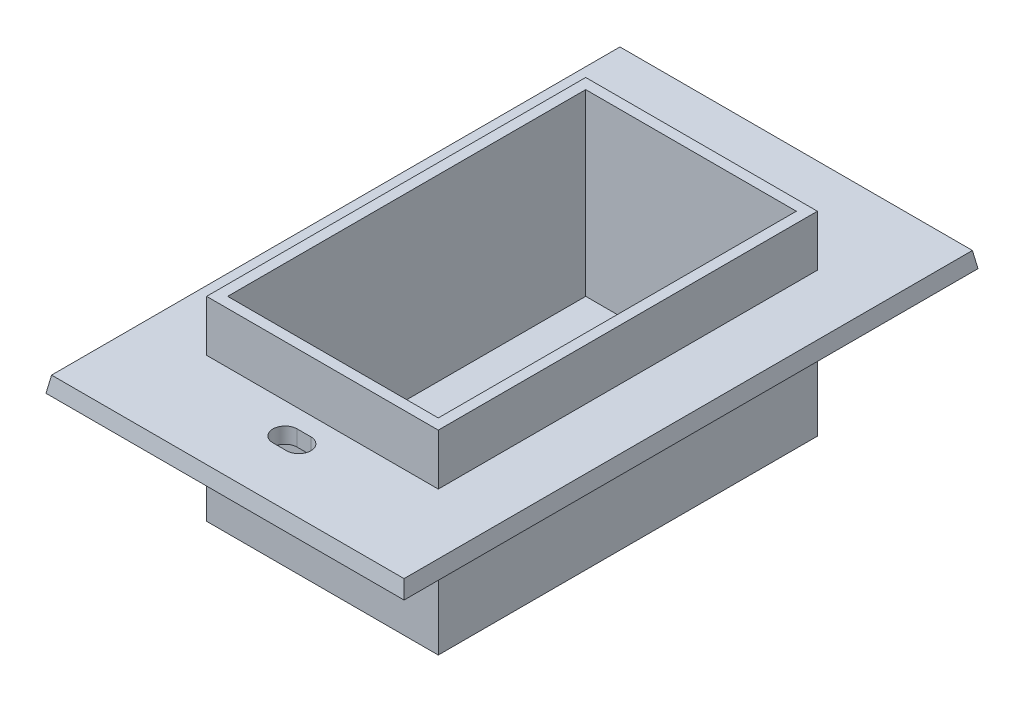
ISO-10303-21;
HEADER;
FILE_DESCRIPTION(('STEP AP214'),'2;1');
FILE_NAME('part.step','',(''),(''),'','','');
FILE_SCHEMA(('AUTOMOTIVE_DESIGN { 1 0 10303 214 1 1 1 1 }'));
ENDSEC;
DATA;
#1=APPLICATION_CONTEXT('core data for automotive mechanical design processes');
#2=APPLICATION_PROTOCOL_DEFINITION('international standard','automotive_design',2000,#1);
#3=PRODUCT_CONTEXT('',#1,'mechanical');
#4=PRODUCT('Part','Part','',(#3));
#5=PRODUCT_RELATED_PRODUCT_CATEGORY('part','',(#4));
#6=PRODUCT_DEFINITION_FORMATION('','',#4);
#7=PRODUCT_DEFINITION_CONTEXT('part definition',#1,'design');
#8=PRODUCT_DEFINITION('design','',#6,#7);
#9=PRODUCT_DEFINITION_SHAPE('','',#8);
#10=(LENGTH_UNIT() NAMED_UNIT(*) SI_UNIT(.MILLI.,.METRE.));
#11=(NAMED_UNIT(*) PLANE_ANGLE_UNIT() SI_UNIT($,.RADIAN.));
#12=(NAMED_UNIT(*) SI_UNIT($,.STERADIAN.) SOLID_ANGLE_UNIT());
#13=UNCERTAINTY_MEASURE_WITH_UNIT(LENGTH_MEASURE(1.E-05),#10,'distance_accuracy_value','');
#14=(GEOMETRIC_REPRESENTATION_CONTEXT(3) GLOBAL_UNCERTAINTY_ASSIGNED_CONTEXT((#13)) GLOBAL_UNIT_ASSIGNED_CONTEXT((#10,
#11,#12)) REPRESENTATION_CONTEXT('',''));
#15=CARTESIAN_POINT('',(0.,0.,0.));
#16=DIRECTION('',(0.,0.,1.));
#17=DIRECTION('',(1.,0.,0.));
#18=AXIS2_PLACEMENT_3D('',#15,#16,#17);
#19=CARTESIAN_POINT('',(0.,3.,0.));
#20=DIRECTION('',(1.,0.,0.));
#21=DIRECTION('',(0.,0.,-1.));
#22=AXIS2_PLACEMENT_3D('',#19,#20,#21);
#23=PLANE('',#22);
#24=DIRECTION('',(0.,-1.,0.));
#25=VECTOR('',#24,1.);
#26=CARTESIAN_POINT('',(0.,3.,-72.));
#27=LINE('',#26,#25);
#28=CARTESIAN_POINT('',(0.,37.,-72.));
#29=VERTEX_POINT('',#28);
#30=CARTESIAN_POINT('',(0.,27.3,-72.));
#31=VERTEX_POINT('',#30);
#32=EDGE_CURVE('E401',#29,#31,#27,.T.);
#33=ORIENTED_EDGE('',*,*,#32,.T.);
#34=DIRECTION('',(0.,0.,1.));
#35=VECTOR('',#34,1.);
#36=CARTESIAN_POINT('',(0.,27.3,-72.));
#37=LINE('',#36,#35);
#38=CARTESIAN_POINT('',(0.,27.3,0.));
#39=VERTEX_POINT('',#38);
#40=EDGE_CURVE('E301',#31,#39,#37,.T.);
#41=ORIENTED_EDGE('',*,*,#40,.T.);
#42=DIRECTION('',(0.,-1.,0.));
#43=VECTOR('',#42,1.);
#44=CARTESIAN_POINT('',(0.,3.,0.));
#45=LINE('',#44,#43);
#46=CARTESIAN_POINT('',(0.,37.,0.));
#47=VERTEX_POINT('',#46);
#48=EDGE_CURVE('E415',#47,#39,#45,.T.);
#49=ORIENTED_EDGE('',*,*,#48,.F.);
#50=DIRECTION('',(0.,0.,1.));
#51=VECTOR('',#50,1.);
#52=CARTESIAN_POINT('',(0.,37.,0.));
#53=LINE('',#52,#51);
#54=EDGE_CURVE('E370',#29,#47,#53,.T.);
#55=ORIENTED_EDGE('',*,*,#54,.F.);
#56=EDGE_LOOP('',(#33,#41,#49,#55));
#57=FACE_BOUND('',#56,.T.);
#58=ADVANCED_FACE('F42',(#57),#23,.F.);
#59=CARTESIAN_POINT('',(0.,3.,0.));
#60=DIRECTION('',(0.,0.,-1.));
#61=DIRECTION('',(-1.,0.,0.));
#62=AXIS2_PLACEMENT_3D('',#59,#60,#61);
#63=PLANE('',#62);
#64=ORIENTED_EDGE('',*,*,#48,.T.);
#65=DIRECTION('',(1.,0.,0.));
#66=VECTOR('',#65,1.);
#67=CARTESIAN_POINT('',(0.,27.3,0.));
#68=LINE('',#67,#66);
#69=CARTESIAN_POINT('',(44.,27.3,0.));
#70=VERTEX_POINT('',#69);
#71=EDGE_CURVE('E289',#39,#70,#68,.T.);
#72=ORIENTED_EDGE('',*,*,#71,.T.);
#73=DIRECTION('',(0.,-1.,0.));
#74=VECTOR('',#73,1.);
#75=CARTESIAN_POINT('',(44.,3.,0.));
#76=LINE('',#75,#74);
#77=CARTESIAN_POINT('',(44.,37.,0.));
#78=VERTEX_POINT('',#77);
#79=EDGE_CURVE('E411',#78,#70,#76,.T.);
#80=ORIENTED_EDGE('',*,*,#79,.F.);
#81=DIRECTION('',(1.,0.,0.));
#82=VECTOR('',#81,1.);
#83=CARTESIAN_POINT('',(0.,37.,0.));
#84=LINE('',#83,#82);
#85=EDGE_CURVE('E374',#47,#78,#84,.T.);
#86=ORIENTED_EDGE('',*,*,#85,.F.);
#87=EDGE_LOOP('',(#64,#72,#80,#86));
#88=FACE_BOUND('',#87,.T.);
#89=ADVANCED_FACE('F476',(#88),#63,.F.);
#90=CARTESIAN_POINT('',(44.,3.,0.));
#91=DIRECTION('',(-1.,0.,0.));
#92=DIRECTION('',(0.,0.,1.));
#93=AXIS2_PLACEMENT_3D('',#90,#91,#92);
#94=PLANE('',#93);
#95=ORIENTED_EDGE('',*,*,#79,.T.);
#96=DIRECTION('',(0.,0.,-1.));
#97=VECTOR('',#96,1.);
#98=CARTESIAN_POINT('',(44.,27.3,-72.));
#99=LINE('',#98,#97);
#100=CARTESIAN_POINT('',(44.,27.3,-72.));
#101=VERTEX_POINT('',#100);
#102=EDGE_CURVE('E292',#70,#101,#99,.T.);
#103=ORIENTED_EDGE('',*,*,#102,.T.);
#104=DIRECTION('',(0.,-1.,0.));
#105=VECTOR('',#104,1.);
#106=CARTESIAN_POINT('',(44.,3.,-72.));
#107=LINE('',#106,#105);
#108=CARTESIAN_POINT('',(44.,37.,-72.));
#109=VERTEX_POINT('',#108);
#110=EDGE_CURVE('E406',#109,#101,#107,.T.);
#111=ORIENTED_EDGE('',*,*,#110,.F.);
#112=DIRECTION('',(0.,0.,-1.));
#113=VECTOR('',#112,1.);
#114=CARTESIAN_POINT('',(44.,37.,0.));
#115=LINE('',#114,#113);
#116=EDGE_CURVE('E377',#78,#109,#115,.T.);
#117=ORIENTED_EDGE('',*,*,#116,.F.);
#118=EDGE_LOOP('',(#95,#103,#111,#117));
#119=FACE_BOUND('',#118,.T.);
#120=ADVANCED_FACE('F483',(#119),#94,.F.);
#121=CARTESIAN_POINT('',(0.,3.,-72.));
#122=DIRECTION('',(0.,0.,1.));
#123=DIRECTION('',(1.,0.,0.));
#124=AXIS2_PLACEMENT_3D('',#121,#122,#123);
#125=PLANE('',#124);
#126=ORIENTED_EDGE('',*,*,#110,.T.);
#127=DIRECTION('',(-1.,0.,0.));
#128=VECTOR('',#127,1.);
#129=CARTESIAN_POINT('',(0.,27.3,-72.));
#130=LINE('',#129,#128);
#131=EDGE_CURVE('E297',#101,#31,#130,.T.);
#132=ORIENTED_EDGE('',*,*,#131,.T.);
#133=ORIENTED_EDGE('',*,*,#32,.F.);
#134=DIRECTION('',(-1.,0.,0.));
#135=VECTOR('',#134,1.);
#136=CARTESIAN_POINT('',(0.,37.,-72.));
#137=LINE('',#136,#135);
#138=EDGE_CURVE('E381',#109,#29,#137,.T.);
#139=ORIENTED_EDGE('',*,*,#138,.F.);
#140=EDGE_LOOP('',(#126,#132,#133,#139));
#141=FACE_BOUND('',#140,.T.);
#142=ADVANCED_FACE('F520',(#141),#125,.F.);
#143=CARTESIAN_POINT('',(0.,37.,0.));
#144=DIRECTION('',(0.,-1.,0.));
#145=DIRECTION('',(0.,0.,-1.));
#146=AXIS2_PLACEMENT_3D('',#143,#144,#145);
#147=PLANE('',#146);
#148=ORIENTED_EDGE('',*,*,#54,.T.);
#149=ORIENTED_EDGE('',*,*,#85,.T.);
#150=ORIENTED_EDGE('',*,*,#116,.T.);
#151=ORIENTED_EDGE('',*,*,#138,.T.);
#152=EDGE_LOOP('',(#148,#149,#150,#151));
#153=FACE_BOUND('',#152,.T.);
#154=DIRECTION('',(0.,0.,1.));
#155=VECTOR('',#154,1.);
#156=CARTESIAN_POINT('',(2.,37.,-1.99999999999998));
#157=LINE('',#156,#155);
#158=CARTESIAN_POINT('',(1.99999999999999,37.,-70.));
#159=VERTEX_POINT('',#158);
#160=CARTESIAN_POINT('',(2.,37.,-1.99999999999998));
#161=VERTEX_POINT('',#160);
#162=EDGE_CURVE('E332',#159,#161,#157,.T.);
#163=ORIENTED_EDGE('',*,*,#162,.F.);
#164=DIRECTION('',(-1.,0.,0.));
#165=VECTOR('',#164,1.);
#166=CARTESIAN_POINT('',(1.99999999999999,37.,-70.));
#167=LINE('',#166,#165);
#168=CARTESIAN_POINT('',(42.,37.,-70.));
#169=VERTEX_POINT('',#168);
#170=EDGE_CURVE('E342',#169,#159,#167,.T.);
#171=ORIENTED_EDGE('',*,*,#170,.F.);
#172=DIRECTION('',(0.,0.,-1.));
#173=VECTOR('',#172,1.);
#174=CARTESIAN_POINT('',(42.,37.,-1.99999999999998));
#175=LINE('',#174,#173);
#176=CARTESIAN_POINT('',(42.,37.,-1.99999999999998));
#177=VERTEX_POINT('',#176);
#178=EDGE_CURVE('E338',#177,#169,#175,.T.);
#179=ORIENTED_EDGE('',*,*,#178,.F.);
#180=DIRECTION('',(1.,0.,0.));
#181=VECTOR('',#180,1.);
#182=CARTESIAN_POINT('',(2.,37.,-1.99999999999998));
#183=LINE('',#182,#181);
#184=EDGE_CURVE('E335',#161,#177,#183,.T.);
#185=ORIENTED_EDGE('',*,*,#184,.F.);
#186=EDGE_LOOP('',(#163,#171,#179,#185));
#187=FACE_BOUND('',#186,.T.);
#188=ADVANCED_FACE('F528',(#153,#187),#147,.F.);
#189=CARTESIAN_POINT('',(2.,37.,-1.99999999999998));
#190=DIRECTION('',(1.,0.,0.));
#191=DIRECTION('',(0.,0.,-1.));
#192=AXIS2_PLACEMENT_3D('',#189,#190,#191);
#193=PLANE('',#192);
#194=DIRECTION('',(0.,0.,1.));
#195=VECTOR('',#194,1.);
#196=CARTESIAN_POINT('',(2.,3.,-1.99999999999998));
#197=LINE('',#196,#195);
#198=CARTESIAN_POINT('',(1.99999999999999,3.,-70.));
#199=VERTEX_POINT('',#198);
#200=CARTESIAN_POINT('',(2.,3.,-1.99999999999998));
#201=VERTEX_POINT('',#200);
#202=EDGE_CURVE('E331',#199,#201,#197,.T.);
#203=ORIENTED_EDGE('',*,*,#202,.F.);
#204=DIRECTION('',(0.,-1.,0.));
#205=VECTOR('',#204,1.);
#206=CARTESIAN_POINT('',(1.99999999999999,37.,-70.));
#207=LINE('',#206,#205);
#208=EDGE_CURVE('E345',#159,#199,#207,.T.);
#209=ORIENTED_EDGE('',*,*,#208,.F.);
#210=ORIENTED_EDGE('',*,*,#162,.T.);
#211=DIRECTION('',(0.,-1.,0.));
#212=VECTOR('',#211,1.);
#213=CARTESIAN_POINT('',(2.,37.,-1.99999999999998));
#214=LINE('',#213,#212);
#215=EDGE_CURVE('E367',#161,#201,#214,.T.);
#216=ORIENTED_EDGE('',*,*,#215,.T.);
#217=EDGE_LOOP('',(#203,#209,#210,#216));
#218=FACE_BOUND('',#217,.T.);
#219=ADVANCED_FACE('F694',(#218),#193,.T.);
#220=CARTESIAN_POINT('',(2.,37.,-1.99999999999998));
#221=DIRECTION('',(0.,0.,-1.));
#222=DIRECTION('',(-1.,0.,0.));
#223=AXIS2_PLACEMENT_3D('',#220,#221,#222);
#224=PLANE('',#223);
#225=DIRECTION('',(1.,0.,0.));
#226=VECTOR('',#225,1.);
#227=CARTESIAN_POINT('',(2.,3.,-1.99999999999998));
#228=LINE('',#227,#226);
#229=CARTESIAN_POINT('',(42.,3.,-1.99999999999998));
#230=VERTEX_POINT('',#229);
#231=EDGE_CURVE('E348',#201,#230,#228,.T.);
#232=ORIENTED_EDGE('',*,*,#231,.F.);
#233=ORIENTED_EDGE('',*,*,#215,.F.);
#234=ORIENTED_EDGE('',*,*,#184,.T.);
#235=DIRECTION('',(0.,-1.,0.));
#236=VECTOR('',#235,1.);
#237=CARTESIAN_POINT('',(42.,37.,-1.99999999999998));
#238=LINE('',#237,#236);
#239=EDGE_CURVE('E364',#177,#230,#238,.T.);
#240=ORIENTED_EDGE('',*,*,#239,.T.);
#241=EDGE_LOOP('',(#232,#233,#234,#240));
#242=FACE_BOUND('',#241,.T.);
#243=ADVANCED_FACE('F691',(#242),#224,.T.);
#244=CARTESIAN_POINT('',(42.,37.,-1.99999999999998));
#245=DIRECTION('',(-1.,0.,0.));
#246=DIRECTION('',(0.,0.,1.));
#247=AXIS2_PLACEMENT_3D('',#244,#245,#246);
#248=PLANE('',#247);
#249=DIRECTION('',(0.,0.,-1.));
#250=VECTOR('',#249,1.);
#251=CARTESIAN_POINT('',(42.,3.,-1.99999999999998));
#252=LINE('',#251,#250);
#253=CARTESIAN_POINT('',(42.,3.,-70.));
#254=VERTEX_POINT('',#253);
#255=EDGE_CURVE('E352',#230,#254,#252,.T.);
#256=ORIENTED_EDGE('',*,*,#255,.F.);
#257=ORIENTED_EDGE('',*,*,#239,.F.);
#258=ORIENTED_EDGE('',*,*,#178,.T.);
#259=DIRECTION('',(0.,-1.,0.));
#260=VECTOR('',#259,1.);
#261=CARTESIAN_POINT('',(42.,37.,-70.));
#262=LINE('',#261,#260);
#263=EDGE_CURVE('E361',#169,#254,#262,.T.);
#264=ORIENTED_EDGE('',*,*,#263,.T.);
#265=EDGE_LOOP('',(#256,#257,#258,#264));
#266=FACE_BOUND('',#265,.T.);
#267=ADVANCED_FACE('F620',(#266),#248,.T.);
#268=CARTESIAN_POINT('',(1.99999999999999,37.,-70.));
#269=DIRECTION('',(0.,0.,1.));
#270=DIRECTION('',(1.,0.,0.));
#271=AXIS2_PLACEMENT_3D('',#268,#269,#270);
#272=PLANE('',#271);
#273=DIRECTION('',(-1.,0.,0.));
#274=VECTOR('',#273,1.);
#275=CARTESIAN_POINT('',(1.99999999999999,3.,-70.));
#276=LINE('',#275,#274);
#277=EDGE_CURVE('E336',#254,#199,#276,.T.);
#278=ORIENTED_EDGE('',*,*,#277,.F.);
#279=ORIENTED_EDGE('',*,*,#263,.F.);
#280=ORIENTED_EDGE('',*,*,#170,.T.);
#281=ORIENTED_EDGE('',*,*,#208,.T.);
#282=EDGE_LOOP('',(#278,#279,#280,#281));
#283=FACE_BOUND('',#282,.T.);
#284=ADVANCED_FACE('F617',(#283),#272,.T.);
#285=CARTESIAN_POINT('',(0.,3.,0.));
#286=DIRECTION('',(0.,-1.,0.));
#287=DIRECTION('',(0.,0.,-1.));
#288=AXIS2_PLACEMENT_3D('',#285,#286,#287);
#289=PLANE('',#288);
#290=ORIENTED_EDGE('',*,*,#277,.T.);
#291=ORIENTED_EDGE('',*,*,#202,.T.);
#292=ORIENTED_EDGE('',*,*,#231,.T.);
#293=ORIENTED_EDGE('',*,*,#255,.T.);
#294=EDGE_LOOP('',(#290,#291,#292,#293));
#295=FACE_BOUND('',#294,.T.);
#296=ADVANCED_FACE('F446',(#295),#289,.F.);
#297=CARTESIAN_POINT('',(0.,27.3,0.));
#298=DIRECTION('',(0.,1.,0.));
#299=DIRECTION('',(0.,0.,1.));
#300=AXIS2_PLACEMENT_3D('',#297,#298,#299);
#301=PLANE('',#300);
#302=DIRECTION('',(0.,0.,-1.));
#303=VECTOR('',#302,1.);
#304=CARTESIAN_POINT('',(55.4710190578746,27.3,-90.5));
#305=LINE('',#304,#303);
#306=CARTESIAN_POINT('',(55.4710190578746,27.3,17.9710190578746));
#307=VERTEX_POINT('',#306);
#308=CARTESIAN_POINT('',(55.4710190578746,27.3,-89.9710190578746));
#309=VERTEX_POINT('',#308);
#310=EDGE_CURVE('E418',#307,#309,#305,.T.);
#311=ORIENTED_EDGE('',*,*,#310,.T.);
#312=DIRECTION('',(-1.,0.,0.));
#313=VECTOR('',#312,1.);
#314=CARTESIAN_POINT('',(-12.,27.3,-89.9710190578746));
#315=LINE('',#314,#313);
#316=CARTESIAN_POINT('',(-11.4710190578746,27.3,-89.9710190578746));
#317=VERTEX_POINT('',#316);
#318=EDGE_CURVE('E11',#309,#317,#315,.T.);
#319=ORIENTED_EDGE('',*,*,#318,.T.);
#320=DIRECTION('',(0.,0.,1.));
#321=VECTOR('',#320,1.);
#322=CARTESIAN_POINT('',(-11.4710190578746,27.3,18.5));
#323=LINE('',#322,#321);
#324=CARTESIAN_POINT('',(-11.4710190578746,27.3,17.9710190578746));
#325=VERTEX_POINT('',#324);
#326=EDGE_CURVE('E51',#317,#325,#323,.T.);
#327=ORIENTED_EDGE('',*,*,#326,.T.);
#328=DIRECTION('',(1.,0.,0.));
#329=VECTOR('',#328,1.);
#330=CARTESIAN_POINT('',(56.,27.3,17.9710190578746));
#331=LINE('',#330,#329);
#332=EDGE_CURVE('E421',#325,#307,#331,.T.);
#333=ORIENTED_EDGE('',*,*,#332,.T.);
#334=EDGE_LOOP('',(#311,#319,#327,#333));
#335=FACE_BOUND('',#334,.T.);
#336=ORIENTED_EDGE('',*,*,#102,.F.);
#337=ORIENTED_EDGE('',*,*,#71,.F.);
#338=ORIENTED_EDGE('',*,*,#40,.F.);
#339=ORIENTED_EDGE('',*,*,#131,.F.);
#340=EDGE_LOOP('',(#336,#337,#338,#339));
#341=FACE_BOUND('',#340,.T.);
#342=DIRECTION('',(1.,0.,0.));
#343=VECTOR('',#342,1.);
#344=CARTESIAN_POINT('',(20.7,27.3,8.10000000000001));
#345=LINE('',#344,#343);
#346=CARTESIAN_POINT('',(20.7,27.3,8.10000000000001));
#347=VERTEX_POINT('',#346);
#348=CARTESIAN_POINT('',(23.3,27.3,8.10000000000001));
#349=VERTEX_POINT('',#348);
#350=EDGE_CURVE('E260',#347,#349,#345,.T.);
#351=ORIENTED_EDGE('',*,*,#350,.F.);
#352=CARTESIAN_POINT('',(20.7,27.3,5.8));
#353=DIRECTION('',(0.,1.,0.));
#354=DIRECTION('',(0.,0.,1.));
#355=AXIS2_PLACEMENT_3D('',#352,#353,#354);
#356=CIRCLE('',#355,2.3);
#357=CARTESIAN_POINT('',(20.7,27.3,3.5));
#358=VERTEX_POINT('',#357);
#359=EDGE_CURVE('E258',#358,#347,#356,.T.);
#360=ORIENTED_EDGE('',*,*,#359,.F.);
#361=DIRECTION('',(-1.,0.,0.));
#362=VECTOR('',#361,1.);
#363=CARTESIAN_POINT('',(20.7,27.3,3.5));
#364=LINE('',#363,#362);
#365=CARTESIAN_POINT('',(23.3,27.3,3.5));
#366=VERTEX_POINT('',#365);
#367=EDGE_CURVE('E266',#366,#358,#364,.T.);
#368=ORIENTED_EDGE('',*,*,#367,.F.);
#369=CARTESIAN_POINT('',(23.3,27.3,5.8));
#370=DIRECTION('',(0.,1.,0.));
#371=DIRECTION('',(0.,0.,1.));
#372=AXIS2_PLACEMENT_3D('',#369,#370,#371);
#373=CIRCLE('',#372,2.3);
#374=EDGE_CURVE('E263',#349,#366,#373,.T.);
#375=ORIENTED_EDGE('',*,*,#374,.F.);
#376=EDGE_LOOP('',(#351,#360,#368,#375));
#377=FACE_BOUND('',#376,.T.);
#378=DIRECTION('',(1.,0.,0.));
#379=VECTOR('',#378,1.);
#380=CARTESIAN_POINT('',(20.7,27.3,-75.5));
#381=LINE('',#380,#379);
#382=CARTESIAN_POINT('',(20.7,27.3,-75.5));
#383=VERTEX_POINT('',#382);
#384=CARTESIAN_POINT('',(23.3,27.3,-75.5));
#385=VERTEX_POINT('',#384);
#386=EDGE_CURVE('E226',#383,#385,#381,.T.);
#387=ORIENTED_EDGE('',*,*,#386,.F.);
#388=CARTESIAN_POINT('',(20.7,27.3,-77.8));
#389=DIRECTION('',(0.,1.,0.));
#390=DIRECTION('',(0.,0.,-1.));
#391=AXIS2_PLACEMENT_3D('',#388,#389,#390);
#392=CIRCLE('',#391,2.3);
#393=CARTESIAN_POINT('',(20.7,27.3,-80.1));
#394=VERTEX_POINT('',#393);
#395=EDGE_CURVE('E216',#394,#383,#392,.T.);
#396=ORIENTED_EDGE('',*,*,#395,.F.);
#397=DIRECTION('',(-1.,0.,0.));
#398=VECTOR('',#397,1.);
#399=CARTESIAN_POINT('',(20.7,27.3,-80.1));
#400=LINE('',#399,#398);
#401=CARTESIAN_POINT('',(23.3,27.3,-80.1));
#402=VERTEX_POINT('',#401);
#403=EDGE_CURVE('E242',#402,#394,#400,.T.);
#404=ORIENTED_EDGE('',*,*,#403,.F.);
#405=CARTESIAN_POINT('',(23.3,27.3,-77.8));
#406=DIRECTION('',(0.,1.,0.));
#407=DIRECTION('',(0.,0.,-1.));
#408=AXIS2_PLACEMENT_3D('',#405,#406,#407);
#409=CIRCLE('',#408,2.3);
#410=EDGE_CURVE('E240',#385,#402,#409,.T.);
#411=ORIENTED_EDGE('',*,*,#410,.F.);
#412=EDGE_LOOP('',(#387,#396,#404,#411));
#413=FACE_BOUND('',#412,.T.);
#414=ADVANCED_FACE('F238',(#335,#341,#377,#413),#301,.T.);
#415=CARTESIAN_POINT('',(0.,24.3,0.));
#416=DIRECTION('',(0.,1.,0.));
#417=DIRECTION('',(0.,0.,1.));
#418=AXIS2_PLACEMENT_3D('',#415,#416,#417);
#419=PLANE('',#418);
#420=CARTESIAN_POINT('',(20.7,24.3,5.8));
#421=DIRECTION('',(0.,1.,0.));
#422=DIRECTION('',(0.,0.,1.));
#423=AXIS2_PLACEMENT_3D('',#420,#421,#422);
#424=CIRCLE('',#423,2.3);
#425=CARTESIAN_POINT('',(20.7,24.3,3.5));
#426=VERTEX_POINT('',#425);
#427=CARTESIAN_POINT('',(20.7,24.3,8.10000000000001));
#428=VERTEX_POINT('',#427);
#429=EDGE_CURVE('E234',#426,#428,#424,.T.);
#430=ORIENTED_EDGE('',*,*,#429,.T.);
#431=DIRECTION('',(1.,0.,0.));
#432=VECTOR('',#431,1.);
#433=CARTESIAN_POINT('',(20.7,24.3,8.10000000000001));
#434=LINE('',#433,#432);
#435=CARTESIAN_POINT('',(23.3,24.3,8.10000000000001));
#436=VERTEX_POINT('',#435);
#437=EDGE_CURVE('E271',#428,#436,#434,.T.);
#438=ORIENTED_EDGE('',*,*,#437,.T.);
#439=CARTESIAN_POINT('',(23.3,24.3,5.8));
#440=DIRECTION('',(0.,1.,0.));
#441=DIRECTION('',(0.,0.,1.));
#442=AXIS2_PLACEMENT_3D('',#439,#440,#441);
#443=CIRCLE('',#442,2.3);
#444=CARTESIAN_POINT('',(23.3,24.3,3.5));
#445=VERTEX_POINT('',#444);
#446=EDGE_CURVE('E274',#436,#445,#443,.T.);
#447=ORIENTED_EDGE('',*,*,#446,.T.);
#448=DIRECTION('',(-1.,0.,0.));
#449=VECTOR('',#448,1.);
#450=CARTESIAN_POINT('',(20.7,24.3,3.5));
#451=LINE('',#450,#449);
#452=EDGE_CURVE('E261',#445,#426,#451,.T.);
#453=ORIENTED_EDGE('',*,*,#452,.T.);
#454=EDGE_LOOP('',(#430,#438,#447,#453));
#455=FACE_BOUND('',#454,.T.);
#456=DIRECTION('',(0.,0.,1.));
#457=VECTOR('',#456,1.);
#458=CARTESIAN_POINT('',(-12.,24.3,18.5));
#459=LINE('',#458,#457);
#460=CARTESIAN_POINT('',(-12.,24.3,-90.5));
#461=VERTEX_POINT('',#460);
#462=CARTESIAN_POINT('',(-12.,24.3,18.5));
#463=VERTEX_POINT('',#462);
#464=EDGE_CURVE('E305',#461,#463,#459,.T.);
#465=ORIENTED_EDGE('',*,*,#464,.F.);
#466=DIRECTION('',(-1.,0.,0.));
#467=VECTOR('',#466,1.);
#468=CARTESIAN_POINT('',(56.,24.3,-90.5));
#469=LINE('',#468,#467);
#470=CARTESIAN_POINT('',(56.,24.3,-90.5));
#471=VERTEX_POINT('',#470);
#472=EDGE_CURVE('E329',#471,#461,#469,.T.);
#473=ORIENTED_EDGE('',*,*,#472,.F.);
#474=DIRECTION('',(0.,0.,-1.));
#475=VECTOR('',#474,1.);
#476=CARTESIAN_POINT('',(56.,24.3,18.5));
#477=LINE('',#476,#475);
#478=CARTESIAN_POINT('',(56.,24.3,18.5));
#479=VERTEX_POINT('',#478);
#480=EDGE_CURVE('E325',#479,#471,#477,.T.);
#481=ORIENTED_EDGE('',*,*,#480,.F.);
#482=DIRECTION('',(1.,0.,0.));
#483=VECTOR('',#482,1.);
#484=CARTESIAN_POINT('',(56.,24.3,18.5));
#485=LINE('',#484,#483);
#486=EDGE_CURVE('E322',#463,#479,#485,.T.);
#487=ORIENTED_EDGE('',*,*,#486,.F.);
#488=EDGE_LOOP('',(#465,#473,#481,#487));
#489=FACE_BOUND('',#488,.T.);
#490=DIRECTION('',(1.,0.,0.));
#491=VECTOR('',#490,1.);
#492=CARTESIAN_POINT('',(0.,24.3,0.));
#493=LINE('',#492,#491);
#494=CARTESIAN_POINT('',(0.,24.3,0.));
#495=VERTEX_POINT('',#494);
#496=CARTESIAN_POINT('',(44.,24.3,0.));
#497=VERTEX_POINT('',#496);
#498=EDGE_CURVE('E288',#495,#497,#493,.T.);
#499=ORIENTED_EDGE('',*,*,#498,.T.);
#500=DIRECTION('',(0.,0.,-1.));
#501=VECTOR('',#500,1.);
#502=CARTESIAN_POINT('',(44.,24.3,-72.));
#503=LINE('',#502,#501);
#504=CARTESIAN_POINT('',(44.,24.3,-72.));
#505=VERTEX_POINT('',#504);
#506=EDGE_CURVE('E308',#497,#505,#503,.T.);
#507=ORIENTED_EDGE('',*,*,#506,.T.);
#508=DIRECTION('',(-1.,0.,0.));
#509=VECTOR('',#508,1.);
#510=CARTESIAN_POINT('',(0.,24.3,-72.));
#511=LINE('',#510,#509);
#512=CARTESIAN_POINT('',(0.,24.3,-72.));
#513=VERTEX_POINT('',#512);
#514=EDGE_CURVE('E312',#505,#513,#511,.T.);
#515=ORIENTED_EDGE('',*,*,#514,.T.);
#516=DIRECTION('',(0.,0.,1.));
#517=VECTOR('',#516,1.);
#518=CARTESIAN_POINT('',(0.,24.3,-72.));
#519=LINE('',#518,#517);
#520=EDGE_CURVE('E293',#513,#495,#519,.T.);
#521=ORIENTED_EDGE('',*,*,#520,.T.);
#522=EDGE_LOOP('',(#499,#507,#515,#521));
#523=FACE_BOUND('',#522,.T.);
#524=CARTESIAN_POINT('',(20.7,24.3,-77.8));
#525=DIRECTION('',(0.,1.,0.));
#526=DIRECTION('',(0.,0.,-1.));
#527=AXIS2_PLACEMENT_3D('',#524,#525,#526);
#528=CIRCLE('',#527,2.3);
#529=CARTESIAN_POINT('',(20.7,24.3,-80.1));
#530=VERTEX_POINT('',#529);
#531=CARTESIAN_POINT('',(20.7,24.3,-75.5));
#532=VERTEX_POINT('',#531);
#533=EDGE_CURVE('E246',#530,#532,#528,.T.);
#534=ORIENTED_EDGE('',*,*,#533,.T.);
#535=DIRECTION('',(1.,0.,0.));
#536=VECTOR('',#535,1.);
#537=CARTESIAN_POINT('',(20.7,24.3,-75.5));
#538=LINE('',#537,#536);
#539=CARTESIAN_POINT('',(23.3,24.3,-75.5));
#540=VERTEX_POINT('',#539);
#541=EDGE_CURVE('E233',#532,#540,#538,.T.);
#542=ORIENTED_EDGE('',*,*,#541,.T.);
#543=CARTESIAN_POINT('',(23.3,24.3,-77.8));
#544=DIRECTION('',(0.,1.,0.));
#545=DIRECTION('',(0.,0.,-1.));
#546=AXIS2_PLACEMENT_3D('',#543,#544,#545);
#547=CIRCLE('',#546,2.3);
#548=CARTESIAN_POINT('',(23.3,24.3,-80.1));
#549=VERTEX_POINT('',#548);
#550=EDGE_CURVE('E249',#540,#549,#547,.T.);
#551=ORIENTED_EDGE('',*,*,#550,.T.);
#552=DIRECTION('',(-1.,0.,0.));
#553=VECTOR('',#552,1.);
#554=CARTESIAN_POINT('',(20.7,24.3,-80.1));
#555=LINE('',#554,#553);
#556=EDGE_CURVE('E227',#549,#530,#555,.T.);
#557=ORIENTED_EDGE('',*,*,#556,.T.);
#558=EDGE_LOOP('',(#534,#542,#551,#557));
#559=FACE_BOUND('',#558,.T.);
#560=ADVANCED_FACE('F440',(#455,#489,#523,#559),#419,.F.);
#561=CARTESIAN_POINT('',(20.7,27.3,5.8));
#562=DIRECTION('',(0.,-1.,0.));
#563=DIRECTION('',(0.,0.,-1.));
#564=AXIS2_PLACEMENT_3D('',#561,#562,#563);
#565=CYLINDRICAL_SURFACE('',#564,2.3);
#566=ORIENTED_EDGE('',*,*,#429,.F.);
#567=DIRECTION('',(0.,-1.,0.));
#568=VECTOR('',#567,1.);
#569=CARTESIAN_POINT('',(20.7,27.3,3.5));
#570=LINE('',#569,#568);
#571=EDGE_CURVE('E268',#358,#426,#570,.T.);
#572=ORIENTED_EDGE('',*,*,#571,.F.);
#573=ORIENTED_EDGE('',*,*,#359,.T.);
#574=DIRECTION('',(0.,-1.,0.));
#575=VECTOR('',#574,1.);
#576=CARTESIAN_POINT('',(20.7,27.3,8.10000000000001));
#577=LINE('',#576,#575);
#578=EDGE_CURVE('E285',#347,#428,#577,.T.);
#579=ORIENTED_EDGE('',*,*,#578,.T.);
#580=EDGE_LOOP('',(#566,#572,#573,#579));
#581=FACE_BOUND('',#580,.T.);
#582=ADVANCED_FACE('F463',(#581),#565,.F.);
#583=CARTESIAN_POINT('',(20.7,27.3,8.10000000000001));
#584=DIRECTION('',(0.,0.,-1.));
#585=DIRECTION('',(-1.,0.,0.));
#586=AXIS2_PLACEMENT_3D('',#583,#584,#585);
#587=PLANE('',#586);
#588=ORIENTED_EDGE('',*,*,#437,.F.);
#589=ORIENTED_EDGE('',*,*,#578,.F.);
#590=ORIENTED_EDGE('',*,*,#350,.T.);
#591=DIRECTION('',(0.,-1.,0.));
#592=VECTOR('',#591,1.);
#593=CARTESIAN_POINT('',(23.3,27.3,8.10000000000001));
#594=LINE('',#593,#592);
#595=EDGE_CURVE('E283',#349,#436,#594,.T.);
#596=ORIENTED_EDGE('',*,*,#595,.T.);
#597=EDGE_LOOP('',(#588,#589,#590,#596));
#598=FACE_BOUND('',#597,.T.);
#599=ADVANCED_FACE('F456',(#598),#587,.T.);
#600=CARTESIAN_POINT('',(23.3,27.3,5.8));
#601=DIRECTION('',(0.,-1.,0.));
#602=DIRECTION('',(0.,0.,-1.));
#603=AXIS2_PLACEMENT_3D('',#600,#601,#602);
#604=CYLINDRICAL_SURFACE('',#603,2.3);
#605=ORIENTED_EDGE('',*,*,#446,.F.);
#606=ORIENTED_EDGE('',*,*,#595,.F.);
#607=ORIENTED_EDGE('',*,*,#374,.T.);
#608=DIRECTION('',(0.,-1.,0.));
#609=VECTOR('',#608,1.);
#610=CARTESIAN_POINT('',(23.3,27.3,3.5));
#611=LINE('',#610,#609);
#612=EDGE_CURVE('E281',#366,#445,#611,.T.);
#613=ORIENTED_EDGE('',*,*,#612,.T.);
#614=EDGE_LOOP('',(#605,#606,#607,#613));
#615=FACE_BOUND('',#614,.T.);
#616=ADVANCED_FACE('F459',(#615),#604,.F.);
#617=CARTESIAN_POINT('',(20.7,27.3,3.5));
#618=DIRECTION('',(0.,0.,1.));
#619=DIRECTION('',(1.,0.,0.));
#620=AXIS2_PLACEMENT_3D('',#617,#618,#619);
#621=PLANE('',#620);
#622=ORIENTED_EDGE('',*,*,#452,.F.);
#623=ORIENTED_EDGE('',*,*,#612,.F.);
#624=ORIENTED_EDGE('',*,*,#367,.T.);
#625=ORIENTED_EDGE('',*,*,#571,.T.);
#626=EDGE_LOOP('',(#622,#623,#624,#625));
#627=FACE_BOUND('',#626,.T.);
#628=ADVANCED_FACE('F466',(#627),#621,.T.);
#629=CARTESIAN_POINT('',(20.7,27.3,-77.8));
#630=DIRECTION('',(0.,-1.,0.));
#631=DIRECTION('',(0.,0.,-1.));
#632=AXIS2_PLACEMENT_3D('',#629,#630,#631);
#633=CYLINDRICAL_SURFACE('',#632,2.3);
#634=ORIENTED_EDGE('',*,*,#533,.F.);
#635=DIRECTION('',(0.,-1.,0.));
#636=VECTOR('',#635,1.);
#637=CARTESIAN_POINT('',(20.7,27.3,-80.1));
#638=LINE('',#637,#636);
#639=EDGE_CURVE('E222',#394,#530,#638,.T.);
#640=ORIENTED_EDGE('',*,*,#639,.F.);
#641=ORIENTED_EDGE('',*,*,#395,.T.);
#642=DIRECTION('',(0.,-1.,0.));
#643=VECTOR('',#642,1.);
#644=CARTESIAN_POINT('',(20.7,27.3,-75.5));
#645=LINE('',#644,#643);
#646=EDGE_CURVE('E219',#383,#532,#645,.T.);
#647=ORIENTED_EDGE('',*,*,#646,.T.);
#648=EDGE_LOOP('',(#634,#640,#641,#647));
#649=FACE_BOUND('',#648,.T.);
#650=ADVANCED_FACE('F218',(#649),#633,.F.);
#651=CARTESIAN_POINT('',(20.7,27.3,-75.5));
#652=DIRECTION('',(0.,0.,-1.));
#653=DIRECTION('',(-1.,0.,0.));
#654=AXIS2_PLACEMENT_3D('',#651,#652,#653);
#655=PLANE('',#654);
#656=ORIENTED_EDGE('',*,*,#541,.F.);
#657=ORIENTED_EDGE('',*,*,#646,.F.);
#658=ORIENTED_EDGE('',*,*,#386,.T.);
#659=DIRECTION('',(0.,-1.,0.));
#660=VECTOR('',#659,1.);
#661=CARTESIAN_POINT('',(23.3,27.3,-75.5));
#662=LINE('',#661,#660);
#663=EDGE_CURVE('E235',#385,#540,#662,.T.);
#664=ORIENTED_EDGE('',*,*,#663,.T.);
#665=EDGE_LOOP('',(#656,#657,#658,#664));
#666=FACE_BOUND('',#665,.T.);
#667=ADVANCED_FACE('F230',(#666),#655,.T.);
#668=CARTESIAN_POINT('',(23.3,27.3,-77.8));
#669=DIRECTION('',(0.,-1.,0.));
#670=DIRECTION('',(0.,0.,-1.));
#671=AXIS2_PLACEMENT_3D('',#668,#669,#670);
#672=CYLINDRICAL_SURFACE('',#671,2.3);
#673=ORIENTED_EDGE('',*,*,#550,.F.);
#674=ORIENTED_EDGE('',*,*,#663,.F.);
#675=ORIENTED_EDGE('',*,*,#410,.T.);
#676=DIRECTION('',(0.,-1.,0.));
#677=VECTOR('',#676,1.);
#678=CARTESIAN_POINT('',(23.3,27.3,-80.1));
#679=LINE('',#678,#677);
#680=EDGE_CURVE('E255',#402,#549,#679,.T.);
#681=ORIENTED_EDGE('',*,*,#680,.T.);
#682=EDGE_LOOP('',(#673,#674,#675,#681));
#683=FACE_BOUND('',#682,.T.);
#684=ADVANCED_FACE('F521',(#683),#672,.F.);
#685=CARTESIAN_POINT('',(20.7,27.3,-80.1));
#686=DIRECTION('',(0.,0.,1.));
#687=DIRECTION('',(1.,0.,0.));
#688=AXIS2_PLACEMENT_3D('',#685,#686,#687);
#689=PLANE('',#688);
#690=ORIENTED_EDGE('',*,*,#556,.F.);
#691=ORIENTED_EDGE('',*,*,#680,.F.);
#692=ORIENTED_EDGE('',*,*,#403,.T.);
#693=ORIENTED_EDGE('',*,*,#639,.T.);
#694=EDGE_LOOP('',(#690,#691,#692,#693));
#695=FACE_BOUND('',#694,.T.);
#696=ADVANCED_FACE('F513',(#695),#689,.T.);
#697=CARTESIAN_POINT('',(0.,0.,0.));
#698=DIRECTION('',(0.,-1.,0.));
#699=DIRECTION('',(0.,0.,-1.));
#700=AXIS2_PLACEMENT_3D('',#697,#698,#699);
#701=PLANE('',#700);
#702=DIRECTION('',(0.,0.,1.));
#703=VECTOR('',#702,1.);
#704=CARTESIAN_POINT('',(0.,0.,0.));
#705=LINE('',#704,#703);
#706=CARTESIAN_POINT('',(0.,0.,-72.));
#707=VERTEX_POINT('',#706);
#708=CARTESIAN_POINT('',(0.,0.,0.));
#709=VERTEX_POINT('',#708);
#710=EDGE_CURVE('E385',#707,#709,#705,.T.);
#711=ORIENTED_EDGE('',*,*,#710,.F.);
#712=DIRECTION('',(-1.,0.,0.));
#713=VECTOR('',#712,1.);
#714=CARTESIAN_POINT('',(0.,0.,-72.));
#715=LINE('',#714,#713);
#716=CARTESIAN_POINT('',(44.,0.,-72.));
#717=VERTEX_POINT('',#716);
#718=EDGE_CURVE('E396',#717,#707,#715,.T.);
#719=ORIENTED_EDGE('',*,*,#718,.F.);
#720=DIRECTION('',(0.,0.,-1.));
#721=VECTOR('',#720,1.);
#722=CARTESIAN_POINT('',(44.,0.,0.));
#723=LINE('',#722,#721);
#724=CARTESIAN_POINT('',(44.,0.,0.));
#725=VERTEX_POINT('',#724);
#726=EDGE_CURVE('E392',#725,#717,#723,.T.);
#727=ORIENTED_EDGE('',*,*,#726,.F.);
#728=DIRECTION('',(1.,0.,0.));
#729=VECTOR('',#728,1.);
#730=CARTESIAN_POINT('',(0.,0.,0.));
#731=LINE('',#730,#729);
#732=EDGE_CURVE('E388',#709,#725,#731,.T.);
#733=ORIENTED_EDGE('',*,*,#732,.F.);
#734=EDGE_LOOP('',(#711,#719,#727,#733));
#735=FACE_BOUND('',#734,.T.);
#736=ADVANCED_FACE('F511',(#735),#701,.T.);
#737=ORIENTED_EDGE('',*,*,#514,.F.);
#738=EDGE_CURVE('E405',#505,#717,#107,.T.);
#739=ORIENTED_EDGE('',*,*,#738,.T.);
#740=ORIENTED_EDGE('',*,*,#718,.T.);
#741=EDGE_CURVE('E400',#513,#707,#27,.T.);
#742=ORIENTED_EDGE('',*,*,#741,.F.);
#743=EDGE_LOOP('',(#737,#739,#740,#742));
#744=FACE_BOUND('',#743,.T.);
#745=ADVANCED_FACE('F501',(#744),#125,.F.);
#746=ORIENTED_EDGE('',*,*,#506,.F.);
#747=EDGE_CURVE('E410',#497,#725,#76,.T.);
#748=ORIENTED_EDGE('',*,*,#747,.T.);
#749=ORIENTED_EDGE('',*,*,#726,.T.);
#750=ORIENTED_EDGE('',*,*,#738,.F.);
#751=EDGE_LOOP('',(#746,#748,#749,#750));
#752=FACE_BOUND('',#751,.T.);
#753=ADVANCED_FACE('F494',(#752),#94,.F.);
#754=ORIENTED_EDGE('',*,*,#498,.F.);
#755=EDGE_CURVE('E414',#495,#709,#45,.T.);
#756=ORIENTED_EDGE('',*,*,#755,.T.);
#757=ORIENTED_EDGE('',*,*,#732,.T.);
#758=ORIENTED_EDGE('',*,*,#747,.F.);
#759=EDGE_LOOP('',(#754,#756,#757,#758));
#760=FACE_BOUND('',#759,.T.);
#761=ADVANCED_FACE('F486',(#760),#63,.F.);
#762=ORIENTED_EDGE('',*,*,#520,.F.);
#763=ORIENTED_EDGE('',*,*,#741,.T.);
#764=ORIENTED_EDGE('',*,*,#710,.T.);
#765=ORIENTED_EDGE('',*,*,#755,.F.);
#766=EDGE_LOOP('',(#762,#763,#764,#765));
#767=FACE_BOUND('',#766,.T.);
#768=ADVANCED_FACE('F479',(#767),#23,.F.);
#769=CARTESIAN_POINT('',(0.,27.3,17.9710190578746));
#770=DIRECTION('',(0.,0.173648177666926,0.984807753012209));
#771=DIRECTION('',(-1.,0.,0.));
#772=AXIS2_PLACEMENT_3D('',#769,#770,#771);
#773=PLANE('',#772);
#774=DIRECTION('',(-0.171087869746031,-0.970287525247815,0.171087869746031));
#775=VECTOR('',#774,1.);
#776=CARTESIAN_POINT('',(-11.1352501802428,29.2042399313069,17.6352501802428));
#777=LINE('',#776,#775);
#778=EDGE_CURVE('E427',#463,#325,#777,.F.);
#779=ORIENTED_EDGE('',*,*,#778,.F.);
#780=ORIENTED_EDGE('',*,*,#486,.T.);
#781=DIRECTION('',(0.171087869746031,-0.970287525247815,0.171087869746031));
#782=VECTOR('',#781,1.);
#783=CARTESIAN_POINT('',(54.9449882956103,30.2832686985895,17.4449882956102));
#784=LINE('',#783,#782);
#785=EDGE_CURVE('E46',#307,#479,#784,.T.);
#786=ORIENTED_EDGE('',*,*,#785,.F.);
#787=ORIENTED_EDGE('',*,*,#332,.F.);
#788=EDGE_LOOP('',(#779,#780,#786,#787));
#789=FACE_BOUND('',#788,.T.);
#790=ADVANCED_FACE('F44',(#789),#773,.T.);
#791=CARTESIAN_POINT('',(55.4710190578746,27.3,0.));
#792=DIRECTION('',(0.984807753012209,0.173648177666926,0.));
#793=DIRECTION('',(0.,0.,1.));
#794=AXIS2_PLACEMENT_3D('',#791,#792,#793);
#795=PLANE('',#794);
#796=ORIENTED_EDGE('',*,*,#785,.T.);
#797=ORIENTED_EDGE('',*,*,#480,.T.);
#798=DIRECTION('',(-0.171087869746032,0.970287525247816,0.171087869746029));
#799=VECTOR('',#798,1.);
#800=CARTESIAN_POINT('',(52.8374720350654,42.2355873515668,-87.3374720350654));
#801=LINE('',#800,#799);
#802=EDGE_CURVE('E426',#309,#471,#801,.F.);
#803=ORIENTED_EDGE('',*,*,#802,.F.);
#804=ORIENTED_EDGE('',*,*,#310,.F.);
#805=EDGE_LOOP('',(#796,#797,#803,#804));
#806=FACE_BOUND('',#805,.T.);
#807=ADVANCED_FACE('F435',(#806),#795,.T.);
#808=CARTESIAN_POINT('',(-11.4710190578746,27.3,0.));
#809=DIRECTION('',(-0.984807753012209,0.173648177666926,0.));
#810=DIRECTION('',(0.,0.,-1.));
#811=AXIS2_PLACEMENT_3D('',#808,#809,#810);
#812=PLANE('',#811);
#813=ORIENTED_EDGE('',*,*,#778,.T.);
#814=ORIENTED_EDGE('',*,*,#326,.F.);
#815=DIRECTION('',(-0.171087869746032,-0.970287525247816,-0.171087869746029));
#816=VECTOR('',#815,1.);
#817=CARTESIAN_POINT('',(-8.83747203506536,42.2355873515668,-87.3374720350654));
#818=LINE('',#817,#816);
#819=EDGE_CURVE('E59',#461,#317,#818,.F.);
#820=ORIENTED_EDGE('',*,*,#819,.F.);
#821=ORIENTED_EDGE('',*,*,#464,.T.);
#822=EDGE_LOOP('',(#813,#814,#820,#821));
#823=FACE_BOUND('',#822,.T.);
#824=ADVANCED_FACE('F443',(#823),#812,.T.);
#825=CARTESIAN_POINT('',(0.,27.3,-89.9710190578746));
#826=DIRECTION('',(0.,0.173648177666924,-0.984807753012209));
#827=DIRECTION('',(1.,0.,0.));
#828=AXIS2_PLACEMENT_3D('',#825,#826,#827);
#829=PLANE('',#828);
#830=ORIENTED_EDGE('',*,*,#802,.T.);
#831=ORIENTED_EDGE('',*,*,#472,.T.);
#832=ORIENTED_EDGE('',*,*,#819,.T.);
#833=ORIENTED_EDGE('',*,*,#318,.F.);
#834=EDGE_LOOP('',(#830,#831,#832,#833));
#835=FACE_BOUND('',#834,.T.);
#836=ADVANCED_FACE('F442',(#835),#829,.T.);
#837=CLOSED_SHELL('',(#58,#89,#120,#142,#188,#219,#243,#267,#284,#296,#414,#560,#582,#599,#616,
#628,#650,#667,#684,#696,#736,#745,#753,#761,#768,#790,#807,#824,#836));
#838=MANIFOLD_SOLID_BREP('B2',#837);
#839=ADVANCED_BREP_SHAPE_REPRESENTATION('',(#18,#838),#14);
#840=SHAPE_DEFINITION_REPRESENTATION(#9,#839);
ENDSEC;
END-ISO-10303-21;
